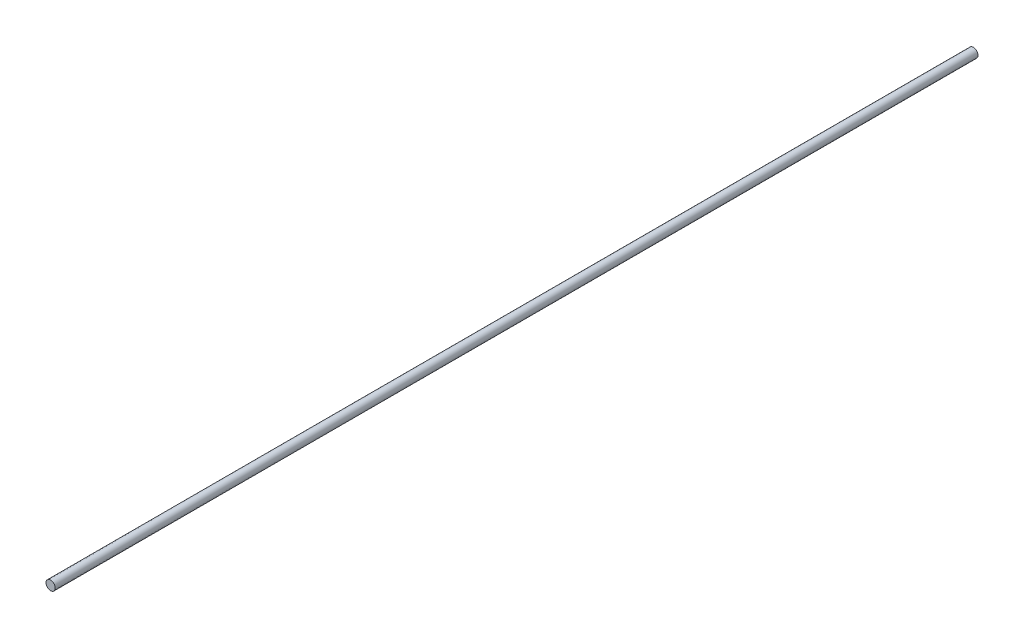
ISO-10303-21;
HEADER;
FILE_DESCRIPTION(('STEP AP214'),'2;1');
FILE_NAME('part.step','',(''),(''),'','','');
FILE_SCHEMA(('AUTOMOTIVE_DESIGN { 1 0 10303 214 1 1 1 1 }'));
ENDSEC;
DATA;
#1=APPLICATION_CONTEXT('core data for automotive mechanical design processes');
#2=APPLICATION_PROTOCOL_DEFINITION('international standard','automotive_design',2000,#1);
#3=PRODUCT_CONTEXT('',#1,'mechanical');
#4=PRODUCT('Part','Part','',(#3));
#5=PRODUCT_RELATED_PRODUCT_CATEGORY('part','',(#4));
#6=PRODUCT_DEFINITION_FORMATION('','',#4);
#7=PRODUCT_DEFINITION_CONTEXT('part definition',#1,'design');
#8=PRODUCT_DEFINITION('design','',#6,#7);
#9=PRODUCT_DEFINITION_SHAPE('','',#8);
#10=(LENGTH_UNIT() NAMED_UNIT(*) SI_UNIT(.MILLI.,.METRE.));
#11=(NAMED_UNIT(*) PLANE_ANGLE_UNIT() SI_UNIT($,.RADIAN.));
#12=(NAMED_UNIT(*) SI_UNIT($,.STERADIAN.) SOLID_ANGLE_UNIT());
#13=UNCERTAINTY_MEASURE_WITH_UNIT(LENGTH_MEASURE(1.E-05),#10,'distance_accuracy_value','');
#14=(GEOMETRIC_REPRESENTATION_CONTEXT(3) GLOBAL_UNCERTAINTY_ASSIGNED_CONTEXT((#13)) GLOBAL_UNIT_ASSIGNED_CONTEXT((#10,
#11,#12)) REPRESENTATION_CONTEXT('',''));
#15=CARTESIAN_POINT('',(0.,0.,0.));
#16=DIRECTION('',(0.,0.,1.));
#17=DIRECTION('',(1.,0.,0.));
#18=AXIS2_PLACEMENT_3D('',#15,#16,#17);
#19=CARTESIAN_POINT('',(0.,0.,100.));
#20=DIRECTION('',(0.,0.,-1.));
#21=DIRECTION('',(-1.,0.,0.));
#22=AXIS2_PLACEMENT_3D('',#19,#20,#21);
#23=CYLINDRICAL_SURFACE('',#22,1.);
#24=CARTESIAN_POINT('',(0.,0.,100.));
#25=DIRECTION('',(0.,0.,1.));
#26=DIRECTION('',(1.,0.,0.));
#27=AXIS2_PLACEMENT_3D('',#24,#25,#26);
#28=CIRCLE('',#27,1.);
#29=CARTESIAN_POINT('',(1.,0.,100.));
#30=VERTEX_POINT('',#29);
#31=EDGE_CURVE('E10',#30,#30,#28,.T.);
#32=ORIENTED_EDGE('',*,*,#31,.F.);
#33=EDGE_LOOP('',(#32));
#34=FACE_BOUND('',#33,.T.);
#35=CARTESIAN_POINT('',(0.,0.,-100.));
#36=DIRECTION('',(0.,0.,1.));
#37=DIRECTION('',(1.,0.,0.));
#38=AXIS2_PLACEMENT_3D('',#35,#36,#37);
#39=CIRCLE('',#38,1.);
#40=CARTESIAN_POINT('',(1.,0.,-100.));
#41=VERTEX_POINT('',#40);
#42=EDGE_CURVE('E34',#41,#41,#39,.T.);
#43=ORIENTED_EDGE('',*,*,#42,.T.);
#44=EDGE_LOOP('',(#43));
#45=FACE_BOUND('',#44,.T.);
#46=ADVANCED_FACE('F31',(#34,#45),#23,.T.);
#47=CARTESIAN_POINT('',(0.,0.,100.));
#48=DIRECTION('',(0.,0.,1.));
#49=DIRECTION('',(1.,0.,0.));
#50=AXIS2_PLACEMENT_3D('',#47,#48,#49);
#51=PLANE('',#50);
#52=ORIENTED_EDGE('',*,*,#31,.T.);
#53=EDGE_LOOP('',(#52));
#54=FACE_BOUND('',#53,.T.);
#55=ADVANCED_FACE('F46',(#54),#51,.T.);
#56=CARTESIAN_POINT('',(0.,0.,-100.));
#57=DIRECTION('',(0.,0.,1.));
#58=DIRECTION('',(1.,0.,0.));
#59=AXIS2_PLACEMENT_3D('',#56,#57,#58);
#60=PLANE('',#59);
#61=ORIENTED_EDGE('',*,*,#42,.F.);
#62=EDGE_LOOP('',(#61));
#63=FACE_BOUND('',#62,.T.);
#64=ADVANCED_FACE('F44',(#63),#60,.F.);
#65=CLOSED_SHELL('',(#46,#55,#64));
#66=MANIFOLD_SOLID_BREP('B2',#65);
#67=ADVANCED_BREP_SHAPE_REPRESENTATION('',(#18,#66),#14);
#68=SHAPE_DEFINITION_REPRESENTATION(#9,#67);
ENDSEC;
END-ISO-10303-21;
